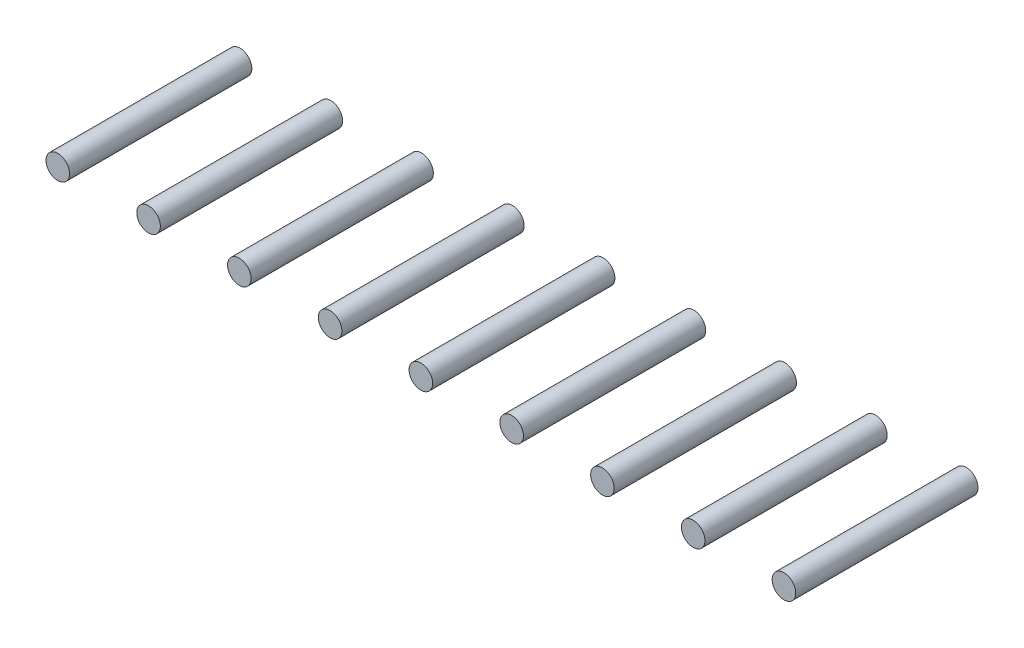
ISO-10303-21;
HEADER;
FILE_DESCRIPTION(('STEP AP214'),'2;1');
FILE_NAME('part.step','',(''),(''),'','','');
FILE_SCHEMA(('AUTOMOTIVE_DESIGN { 1 0 10303 214 1 1 1 1 }'));
ENDSEC;
DATA;
#1=APPLICATION_CONTEXT('core data for automotive mechanical design processes');
#2=APPLICATION_PROTOCOL_DEFINITION('international standard','automotive_design',2000,#1);
#3=PRODUCT_CONTEXT('',#1,'mechanical');
#4=PRODUCT('Part','Part','',(#3));
#5=PRODUCT_RELATED_PRODUCT_CATEGORY('part','',(#4));
#6=PRODUCT_DEFINITION_FORMATION('','',#4);
#7=PRODUCT_DEFINITION_CONTEXT('part definition',#1,'design');
#8=PRODUCT_DEFINITION('design','',#6,#7);
#9=PRODUCT_DEFINITION_SHAPE('','',#8);
#10=(LENGTH_UNIT() NAMED_UNIT(*) SI_UNIT(.MILLI.,.METRE.));
#11=(NAMED_UNIT(*) PLANE_ANGLE_UNIT() SI_UNIT($,.RADIAN.));
#12=(NAMED_UNIT(*) SI_UNIT($,.STERADIAN.) SOLID_ANGLE_UNIT());
#13=UNCERTAINTY_MEASURE_WITH_UNIT(LENGTH_MEASURE(1.E-05),#10,'distance_accuracy_value','');
#14=(GEOMETRIC_REPRESENTATION_CONTEXT(3) GLOBAL_UNCERTAINTY_ASSIGNED_CONTEXT((#13)) GLOBAL_UNIT_ASSIGNED_CONTEXT((#10,
#11,#12)) REPRESENTATION_CONTEXT('',''));
#15=CARTESIAN_POINT('',(0.,0.,0.));
#16=DIRECTION('',(0.,0.,1.));
#17=DIRECTION('',(1.,0.,0.));
#18=AXIS2_PLACEMENT_3D('',#15,#16,#17);
#19=CARTESIAN_POINT('',(0.,0.,-5.));
#20=DIRECTION('',(0.,0.,1.));
#21=DIRECTION('',(1.,0.,0.));
#22=AXIS2_PLACEMENT_3D('',#19,#20,#21);
#23=PLANE('',#22);
#24=CARTESIAN_POINT('',(0.,0.,-5.));
#25=DIRECTION('',(0.,0.,1.));
#26=DIRECTION('',(1.,0.,0.));
#27=AXIS2_PLACEMENT_3D('',#24,#25,#26);
#28=CIRCLE('',#27,0.33);
#29=CARTESIAN_POINT('',(0.33,0.,-5.));
#30=VERTEX_POINT('',#29);
#31=EDGE_CURVE('P0_E11',#30,#30,#28,.T.);
#32=ORIENTED_EDGE('',*,*,#31,.F.);
#33=EDGE_LOOP('',(#32));
#34=FACE_BOUND('',#33,.T.);
#35=ADVANCED_FACE('P0_F16',(#34),#23,.F.);
#36=CARTESIAN_POINT('',(0.,0.,0.1));
#37=DIRECTION('',(0.,0.,1.));
#38=DIRECTION('',(1.,0.,0.));
#39=AXIS2_PLACEMENT_3D('',#36,#37,#38);
#40=PLANE('',#39);
#41=CARTESIAN_POINT('',(0.,0.,0.1));
#42=DIRECTION('',(0.,0.,1.));
#43=DIRECTION('',(1.,0.,0.));
#44=AXIS2_PLACEMENT_3D('',#41,#42,#43);
#45=CIRCLE('',#44,0.33);
#46=CARTESIAN_POINT('',(0.33,0.,0.1));
#47=VERTEX_POINT('',#46);
#48=EDGE_CURVE('P0_E41',#47,#47,#45,.T.);
#49=ORIENTED_EDGE('',*,*,#48,.T.);
#50=EDGE_LOOP('',(#49));
#51=FACE_BOUND('',#50,.T.);
#52=ADVANCED_FACE('P0_F44',(#51),#40,.T.);
#53=CARTESIAN_POINT('',(0.,0.,-5.));
#54=DIRECTION('',(0.,0.,1.));
#55=DIRECTION('',(1.,0.,0.));
#56=AXIS2_PLACEMENT_3D('',#53,#54,#55);
#57=CYLINDRICAL_SURFACE('',#56,0.33);
#58=ORIENTED_EDGE('',*,*,#48,.F.);
#59=DIRECTION('',(0.,0.,1.));
#60=VECTOR('',#59,1.);
#61=CARTESIAN_POINT('',(0.33,0.,-5.));
#62=LINE('',#61,#60);
#63=EDGE_CURVE('P0_E20',#30,#47,#62,.T.);
#64=ORIENTED_EDGE('',*,*,#63,.F.);
#65=ORIENTED_EDGE('',*,*,#31,.T.);
#66=ORIENTED_EDGE('',*,*,#63,.T.);
#67=EDGE_LOOP('',(#58,#64,#65,#66));
#68=FACE_BOUND('',#67,.T.);
#69=ADVANCED_FACE('P0_F18',(#68),#57,.T.);
#70=CLOSED_SHELL('',(#35,#52,#69));
#71=MANIFOLD_SOLID_BREP('P0_B1',#70);
#72=CARTESIAN_POINT('',(2.54,0.,-5.));
#73=DIRECTION('',(0.,0.,1.));
#74=DIRECTION('',(1.,0.,0.));
#75=AXIS2_PLACEMENT_3D('',#72,#73,#74);
#76=PLANE('',#75);
#77=CARTESIAN_POINT('',(2.54,0.,-5.));
#78=DIRECTION('',(0.,0.,1.));
#79=DIRECTION('',(1.,0.,0.));
#80=AXIS2_PLACEMENT_3D('',#77,#78,#79);
#81=CIRCLE('',#80,0.33);
#82=CARTESIAN_POINT('',(2.87,0.,-5.));
#83=VERTEX_POINT('',#82);
#84=EDGE_CURVE('P1_E11',#83,#83,#81,.T.);
#85=ORIENTED_EDGE('',*,*,#84,.F.);
#86=EDGE_LOOP('',(#85));
#87=FACE_BOUND('',#86,.T.);
#88=ADVANCED_FACE('P1_F16',(#87),#76,.F.);
#89=CARTESIAN_POINT('',(2.54,0.,0.1));
#90=DIRECTION('',(0.,0.,1.));
#91=DIRECTION('',(1.,0.,0.));
#92=AXIS2_PLACEMENT_3D('',#89,#90,#91);
#93=PLANE('',#92);
#94=CARTESIAN_POINT('',(2.54,0.,0.1));
#95=DIRECTION('',(0.,0.,1.));
#96=DIRECTION('',(1.,0.,0.));
#97=AXIS2_PLACEMENT_3D('',#94,#95,#96);
#98=CIRCLE('',#97,0.33);
#99=CARTESIAN_POINT('',(2.87,0.,0.1));
#100=VERTEX_POINT('',#99);
#101=EDGE_CURVE('P1_E40',#100,#100,#98,.T.);
#102=ORIENTED_EDGE('',*,*,#101,.T.);
#103=EDGE_LOOP('',(#102));
#104=FACE_BOUND('',#103,.T.);
#105=ADVANCED_FACE('P1_F43',(#104),#93,.T.);
#106=CARTESIAN_POINT('',(2.54,0.,-5.));
#107=DIRECTION('',(0.,0.,1.));
#108=DIRECTION('',(1.,0.,0.));
#109=AXIS2_PLACEMENT_3D('',#106,#107,#108);
#110=CYLINDRICAL_SURFACE('',#109,0.33);
#111=ORIENTED_EDGE('',*,*,#101,.F.);
#112=DIRECTION('',(0.,0.,1.));
#113=VECTOR('',#112,1.);
#114=CARTESIAN_POINT('',(2.87,0.,-5.));
#115=LINE('',#114,#113);
#116=EDGE_CURVE('P1_E24',#83,#100,#115,.T.);
#117=ORIENTED_EDGE('',*,*,#116,.F.);
#118=ORIENTED_EDGE('',*,*,#84,.T.);
#119=ORIENTED_EDGE('',*,*,#116,.T.);
#120=EDGE_LOOP('',(#111,#117,#118,#119));
#121=FACE_BOUND('',#120,.T.);
#122=ADVANCED_FACE('P1_F39',(#121),#110,.T.);
#123=CLOSED_SHELL('',(#88,#105,#122));
#124=MANIFOLD_SOLID_BREP('P1_B1',#123);
#125=CARTESIAN_POINT('',(5.08,0.,-5.));
#126=DIRECTION('',(0.,0.,1.));
#127=DIRECTION('',(1.,0.,0.));
#128=AXIS2_PLACEMENT_3D('',#125,#126,#127);
#129=PLANE('',#128);
#130=CARTESIAN_POINT('',(5.08,0.,-5.));
#131=DIRECTION('',(0.,0.,1.));
#132=DIRECTION('',(1.,0.,0.));
#133=AXIS2_PLACEMENT_3D('',#130,#131,#132);
#134=CIRCLE('',#133,0.33);
#135=CARTESIAN_POINT('',(5.41,0.,-5.));
#136=VERTEX_POINT('',#135);
#137=EDGE_CURVE('P2_E11',#136,#136,#134,.T.);
#138=ORIENTED_EDGE('',*,*,#137,.F.);
#139=EDGE_LOOP('',(#138));
#140=FACE_BOUND('',#139,.T.);
#141=ADVANCED_FACE('P2_F16',(#140),#129,.F.);
#142=CARTESIAN_POINT('',(5.08,0.,0.1));
#143=DIRECTION('',(0.,0.,1.));
#144=DIRECTION('',(1.,0.,0.));
#145=AXIS2_PLACEMENT_3D('',#142,#143,#144);
#146=PLANE('',#145);
#147=CARTESIAN_POINT('',(5.08,0.,0.1));
#148=DIRECTION('',(0.,0.,1.));
#149=DIRECTION('',(1.,0.,0.));
#150=AXIS2_PLACEMENT_3D('',#147,#148,#149);
#151=CIRCLE('',#150,0.33);
#152=CARTESIAN_POINT('',(5.41,0.,0.1));
#153=VERTEX_POINT('',#152);
#154=EDGE_CURVE('P2_E41',#153,#153,#151,.T.);
#155=ORIENTED_EDGE('',*,*,#154,.T.);
#156=EDGE_LOOP('',(#155));
#157=FACE_BOUND('',#156,.T.);
#158=ADVANCED_FACE('P2_F44',(#157),#146,.T.);
#159=CARTESIAN_POINT('',(5.08,0.,-5.));
#160=DIRECTION('',(0.,0.,1.));
#161=DIRECTION('',(1.,0.,0.));
#162=AXIS2_PLACEMENT_3D('',#159,#160,#161);
#163=CYLINDRICAL_SURFACE('',#162,0.33);
#164=ORIENTED_EDGE('',*,*,#154,.F.);
#165=DIRECTION('',(0.,0.,1.));
#166=VECTOR('',#165,1.);
#167=CARTESIAN_POINT('',(5.41,0.,-5.));
#168=LINE('',#167,#166);
#169=EDGE_CURVE('P2_E20',#136,#153,#168,.T.);
#170=ORIENTED_EDGE('',*,*,#169,.F.);
#171=ORIENTED_EDGE('',*,*,#137,.T.);
#172=ORIENTED_EDGE('',*,*,#169,.T.);
#173=EDGE_LOOP('',(#164,#170,#171,#172));
#174=FACE_BOUND('',#173,.T.);
#175=ADVANCED_FACE('P2_F18',(#174),#163,.T.);
#176=CLOSED_SHELL('',(#141,#158,#175));
#177=MANIFOLD_SOLID_BREP('P2_B1',#176);
#178=CARTESIAN_POINT('',(7.62,0.,-5.));
#179=DIRECTION('',(0.,0.,1.));
#180=DIRECTION('',(1.,0.,0.));
#181=AXIS2_PLACEMENT_3D('',#178,#179,#180);
#182=PLANE('',#181);
#183=CARTESIAN_POINT('',(7.62,0.,-5.));
#184=DIRECTION('',(0.,0.,1.));
#185=DIRECTION('',(1.,0.,0.));
#186=AXIS2_PLACEMENT_3D('',#183,#184,#185);
#187=CIRCLE('',#186,0.33);
#188=CARTESIAN_POINT('',(7.95,0.,-5.));
#189=VERTEX_POINT('',#188);
#190=EDGE_CURVE('P3_E11',#189,#189,#187,.T.);
#191=ORIENTED_EDGE('',*,*,#190,.F.);
#192=EDGE_LOOP('',(#191));
#193=FACE_BOUND('',#192,.T.);
#194=ADVANCED_FACE('P3_F16',(#193),#182,.F.);
#195=CARTESIAN_POINT('',(7.62,0.,0.1));
#196=DIRECTION('',(0.,0.,1.));
#197=DIRECTION('',(1.,0.,0.));
#198=AXIS2_PLACEMENT_3D('',#195,#196,#197);
#199=PLANE('',#198);
#200=CARTESIAN_POINT('',(7.62,0.,0.1));
#201=DIRECTION('',(0.,0.,1.));
#202=DIRECTION('',(1.,0.,0.));
#203=AXIS2_PLACEMENT_3D('',#200,#201,#202);
#204=CIRCLE('',#203,0.33);
#205=CARTESIAN_POINT('',(7.95,0.,0.1));
#206=VERTEX_POINT('',#205);
#207=EDGE_CURVE('P3_E42',#206,#206,#204,.T.);
#208=ORIENTED_EDGE('',*,*,#207,.T.);
#209=EDGE_LOOP('',(#208));
#210=FACE_BOUND('',#209,.T.);
#211=ADVANCED_FACE('P3_F18',(#210),#199,.T.);
#212=CARTESIAN_POINT('',(7.62,0.,-5.));
#213=DIRECTION('',(0.,0.,1.));
#214=DIRECTION('',(1.,0.,0.));
#215=AXIS2_PLACEMENT_3D('',#212,#213,#214);
#216=CYLINDRICAL_SURFACE('',#215,0.33);
#217=ORIENTED_EDGE('',*,*,#207,.F.);
#218=DIRECTION('',(0.,0.,1.));
#219=VECTOR('',#218,1.);
#220=CARTESIAN_POINT('',(7.95,0.,-5.));
#221=LINE('',#220,#219);
#222=EDGE_CURVE('P3_E20',#189,#206,#221,.T.);
#223=ORIENTED_EDGE('',*,*,#222,.F.);
#224=ORIENTED_EDGE('',*,*,#190,.T.);
#225=ORIENTED_EDGE('',*,*,#222,.T.);
#226=EDGE_LOOP('',(#217,#223,#224,#225));
#227=FACE_BOUND('',#226,.T.);
#228=ADVANCED_FACE('P3_F41',(#227),#216,.T.);
#229=CLOSED_SHELL('',(#194,#211,#228));
#230=MANIFOLD_SOLID_BREP('P3_B1',#229);
#231=CARTESIAN_POINT('',(10.16,0.,-5.));
#232=DIRECTION('',(0.,0.,1.));
#233=DIRECTION('',(1.,0.,0.));
#234=AXIS2_PLACEMENT_3D('',#231,#232,#233);
#235=PLANE('',#234);
#236=CARTESIAN_POINT('',(10.16,0.,-5.));
#237=DIRECTION('',(0.,0.,1.));
#238=DIRECTION('',(1.,0.,0.));
#239=AXIS2_PLACEMENT_3D('',#236,#237,#238);
#240=CIRCLE('',#239,0.33);
#241=CARTESIAN_POINT('',(10.49,0.,-5.));
#242=VERTEX_POINT('',#241);
#243=EDGE_CURVE('P4_E11',#242,#242,#240,.T.);
#244=ORIENTED_EDGE('',*,*,#243,.F.);
#245=EDGE_LOOP('',(#244));
#246=FACE_BOUND('',#245,.T.);
#247=ADVANCED_FACE('P4_F16',(#246),#235,.F.);
#248=CARTESIAN_POINT('',(10.16,0.,0.1));
#249=DIRECTION('',(0.,0.,1.));
#250=DIRECTION('',(1.,0.,0.));
#251=AXIS2_PLACEMENT_3D('',#248,#249,#250);
#252=PLANE('',#251);
#253=CARTESIAN_POINT('',(10.16,0.,0.1));
#254=DIRECTION('',(0.,0.,1.));
#255=DIRECTION('',(1.,0.,0.));
#256=AXIS2_PLACEMENT_3D('',#253,#254,#255);
#257=CIRCLE('',#256,0.33);
#258=CARTESIAN_POINT('',(10.49,0.,0.1));
#259=VERTEX_POINT('',#258);
#260=EDGE_CURVE('P4_E41',#259,#259,#257,.T.);
#261=ORIENTED_EDGE('',*,*,#260,.T.);
#262=EDGE_LOOP('',(#261));
#263=FACE_BOUND('',#262,.T.);
#264=ADVANCED_FACE('P4_F44',(#263),#252,.T.);
#265=CARTESIAN_POINT('',(10.16,0.,-5.));
#266=DIRECTION('',(0.,0.,1.));
#267=DIRECTION('',(1.,0.,0.));
#268=AXIS2_PLACEMENT_3D('',#265,#266,#267);
#269=CYLINDRICAL_SURFACE('',#268,0.33);
#270=ORIENTED_EDGE('',*,*,#260,.F.);
#271=DIRECTION('',(0.,0.,1.));
#272=VECTOR('',#271,1.);
#273=CARTESIAN_POINT('',(10.49,0.,-5.));
#274=LINE('',#273,#272);
#275=EDGE_CURVE('P4_E19',#242,#259,#274,.T.);
#276=ORIENTED_EDGE('',*,*,#275,.F.);
#277=ORIENTED_EDGE('',*,*,#243,.T.);
#278=ORIENTED_EDGE('',*,*,#275,.T.);
#279=EDGE_LOOP('',(#270,#276,#277,#278));
#280=FACE_BOUND('',#279,.T.);
#281=ADVANCED_FACE('P4_F40',(#280),#269,.T.);
#282=CLOSED_SHELL('',(#247,#264,#281));
#283=MANIFOLD_SOLID_BREP('P4_B1',#282);
#284=CARTESIAN_POINT('',(12.7,0.,-5.));
#285=DIRECTION('',(0.,0.,1.));
#286=DIRECTION('',(1.,0.,0.));
#287=AXIS2_PLACEMENT_3D('',#284,#285,#286);
#288=PLANE('',#287);
#289=CARTESIAN_POINT('',(12.7,0.,-5.));
#290=DIRECTION('',(0.,0.,1.));
#291=DIRECTION('',(1.,0.,0.));
#292=AXIS2_PLACEMENT_3D('',#289,#290,#291);
#293=CIRCLE('',#292,0.33);
#294=CARTESIAN_POINT('',(13.03,0.,-5.));
#295=VERTEX_POINT('',#294);
#296=EDGE_CURVE('P5_E11',#295,#295,#293,.T.);
#297=ORIENTED_EDGE('',*,*,#296,.F.);
#298=EDGE_LOOP('',(#297));
#299=FACE_BOUND('',#298,.T.);
#300=ADVANCED_FACE('P5_F16',(#299),#288,.F.);
#301=CARTESIAN_POINT('',(12.7,0.,0.1));
#302=DIRECTION('',(0.,0.,1.));
#303=DIRECTION('',(1.,0.,0.));
#304=AXIS2_PLACEMENT_3D('',#301,#302,#303);
#305=PLANE('',#304);
#306=CARTESIAN_POINT('',(12.7,0.,0.1));
#307=DIRECTION('',(0.,0.,1.));
#308=DIRECTION('',(1.,0.,0.));
#309=AXIS2_PLACEMENT_3D('',#306,#307,#308);
#310=CIRCLE('',#309,0.33);
#311=CARTESIAN_POINT('',(13.03,0.,0.1));
#312=VERTEX_POINT('',#311);
#313=EDGE_CURVE('P5_E20',#312,#312,#310,.T.);
#314=ORIENTED_EDGE('',*,*,#313,.T.);
#315=EDGE_LOOP('',(#314));
#316=FACE_BOUND('',#315,.T.);
#317=ADVANCED_FACE('P5_F44',(#316),#305,.T.);
#318=CARTESIAN_POINT('',(12.7,0.,-5.));
#319=DIRECTION('',(0.,0.,1.));
#320=DIRECTION('',(1.,0.,0.));
#321=AXIS2_PLACEMENT_3D('',#318,#319,#320);
#322=CYLINDRICAL_SURFACE('',#321,0.33);
#323=ORIENTED_EDGE('',*,*,#313,.F.);
#324=DIRECTION('',(0.,0.,1.));
#325=VECTOR('',#324,1.);
#326=CARTESIAN_POINT('',(13.03,0.,-5.));
#327=LINE('',#326,#325);
#328=EDGE_CURVE('P5_E27',#295,#312,#327,.T.);
#329=ORIENTED_EDGE('',*,*,#328,.F.);
#330=ORIENTED_EDGE('',*,*,#296,.T.);
#331=ORIENTED_EDGE('',*,*,#328,.T.);
#332=EDGE_LOOP('',(#323,#329,#330,#331));
#333=FACE_BOUND('',#332,.T.);
#334=ADVANCED_FACE('P5_F18',(#333),#322,.T.);
#335=CLOSED_SHELL('',(#300,#317,#334));
#336=MANIFOLD_SOLID_BREP('P5_B1',#335);
#337=CARTESIAN_POINT('',(15.24,0.,-5.));
#338=DIRECTION('',(0.,0.,1.));
#339=DIRECTION('',(1.,0.,0.));
#340=AXIS2_PLACEMENT_3D('',#337,#338,#339);
#341=PLANE('',#340);
#342=CARTESIAN_POINT('',(15.24,0.,-5.));
#343=DIRECTION('',(0.,0.,1.));
#344=DIRECTION('',(1.,0.,0.));
#345=AXIS2_PLACEMENT_3D('',#342,#343,#344);
#346=CIRCLE('',#345,0.33);
#347=CARTESIAN_POINT('',(15.57,0.,-5.));
#348=VERTEX_POINT('',#347);
#349=EDGE_CURVE('P6_E11',#348,#348,#346,.T.);
#350=ORIENTED_EDGE('',*,*,#349,.F.);
#351=EDGE_LOOP('',(#350));
#352=FACE_BOUND('',#351,.T.);
#353=ADVANCED_FACE('P6_F16',(#352),#341,.F.);
#354=CARTESIAN_POINT('',(15.24,0.,0.1));
#355=DIRECTION('',(0.,0.,1.));
#356=DIRECTION('',(1.,0.,0.));
#357=AXIS2_PLACEMENT_3D('',#354,#355,#356);
#358=PLANE('',#357);
#359=CARTESIAN_POINT('',(15.24,0.,0.1));
#360=DIRECTION('',(0.,0.,1.));
#361=DIRECTION('',(1.,0.,0.));
#362=AXIS2_PLACEMENT_3D('',#359,#360,#361);
#363=CIRCLE('',#362,0.33);
#364=CARTESIAN_POINT('',(15.57,0.,0.1));
#365=VERTEX_POINT('',#364);
#366=EDGE_CURVE('P6_E41',#365,#365,#363,.T.);
#367=ORIENTED_EDGE('',*,*,#366,.T.);
#368=EDGE_LOOP('',(#367));
#369=FACE_BOUND('',#368,.T.);
#370=ADVANCED_FACE('P6_F18',(#369),#358,.T.);
#371=CARTESIAN_POINT('',(15.24,0.,-5.));
#372=DIRECTION('',(0.,0.,1.));
#373=DIRECTION('',(1.,0.,0.));
#374=AXIS2_PLACEMENT_3D('',#371,#372,#373);
#375=CYLINDRICAL_SURFACE('',#374,0.33);
#376=ORIENTED_EDGE('',*,*,#366,.F.);
#377=DIRECTION('',(0.,0.,1.));
#378=VECTOR('',#377,1.);
#379=CARTESIAN_POINT('',(15.57,0.,-5.));
#380=LINE('',#379,#378);
#381=EDGE_CURVE('P6_E25',#348,#365,#380,.T.);
#382=ORIENTED_EDGE('',*,*,#381,.F.);
#383=ORIENTED_EDGE('',*,*,#349,.T.);
#384=ORIENTED_EDGE('',*,*,#381,.T.);
#385=EDGE_LOOP('',(#376,#382,#383,#384));
#386=FACE_BOUND('',#385,.T.);
#387=ADVANCED_FACE('P6_F40',(#386),#375,.T.);
#388=CLOSED_SHELL('',(#353,#370,#387));
#389=MANIFOLD_SOLID_BREP('P6_B1',#388);
#390=CARTESIAN_POINT('',(17.78,0.,-5.));
#391=DIRECTION('',(0.,0.,1.));
#392=DIRECTION('',(1.,0.,0.));
#393=AXIS2_PLACEMENT_3D('',#390,#391,#392);
#394=PLANE('',#393);
#395=CARTESIAN_POINT('',(17.78,0.,-5.));
#396=DIRECTION('',(0.,0.,1.));
#397=DIRECTION('',(1.,0.,0.));
#398=AXIS2_PLACEMENT_3D('',#395,#396,#397);
#399=CIRCLE('',#398,0.33);
#400=CARTESIAN_POINT('',(18.11,0.,-5.));
#401=VERTEX_POINT('',#400);
#402=EDGE_CURVE('P7_E11',#401,#401,#399,.T.);
#403=ORIENTED_EDGE('',*,*,#402,.F.);
#404=EDGE_LOOP('',(#403));
#405=FACE_BOUND('',#404,.T.);
#406=ADVANCED_FACE('P7_F16',(#405),#394,.F.);
#407=CARTESIAN_POINT('',(17.78,0.,0.1));
#408=DIRECTION('',(0.,0.,1.));
#409=DIRECTION('',(1.,0.,0.));
#410=AXIS2_PLACEMENT_3D('',#407,#408,#409);
#411=PLANE('',#410);
#412=CARTESIAN_POINT('',(17.78,0.,0.1));
#413=DIRECTION('',(0.,0.,1.));
#414=DIRECTION('',(1.,0.,0.));
#415=AXIS2_PLACEMENT_3D('',#412,#413,#414);
#416=CIRCLE('',#415,0.33);
#417=CARTESIAN_POINT('',(18.11,0.,0.1));
#418=VERTEX_POINT('',#417);
#419=EDGE_CURVE('P7_E41',#418,#418,#416,.T.);
#420=ORIENTED_EDGE('',*,*,#419,.T.);
#421=EDGE_LOOP('',(#420));
#422=FACE_BOUND('',#421,.T.);
#423=ADVANCED_FACE('P7_F18',(#422),#411,.T.);
#424=CARTESIAN_POINT('',(17.78,0.,-5.));
#425=DIRECTION('',(0.,0.,1.));
#426=DIRECTION('',(1.,0.,0.));
#427=AXIS2_PLACEMENT_3D('',#424,#425,#426);
#428=CYLINDRICAL_SURFACE('',#427,0.33);
#429=ORIENTED_EDGE('',*,*,#419,.F.);
#430=DIRECTION('',(0.,0.,1.));
#431=VECTOR('',#430,1.);
#432=CARTESIAN_POINT('',(18.11,0.,-5.));
#433=LINE('',#432,#431);
#434=EDGE_CURVE('P7_E20',#401,#418,#433,.T.);
#435=ORIENTED_EDGE('',*,*,#434,.F.);
#436=ORIENTED_EDGE('',*,*,#402,.T.);
#437=ORIENTED_EDGE('',*,*,#434,.T.);
#438=EDGE_LOOP('',(#429,#435,#436,#437));
#439=FACE_BOUND('',#438,.T.);
#440=ADVANCED_FACE('P7_F40',(#439),#428,.T.);
#441=CLOSED_SHELL('',(#406,#423,#440));
#442=MANIFOLD_SOLID_BREP('P7_B1',#441);
#443=CARTESIAN_POINT('',(20.32,0.,-5.));
#444=DIRECTION('',(0.,0.,1.));
#445=DIRECTION('',(1.,0.,0.));
#446=AXIS2_PLACEMENT_3D('',#443,#444,#445);
#447=PLANE('',#446);
#448=CARTESIAN_POINT('',(20.32,0.,-5.));
#449=DIRECTION('',(0.,0.,1.));
#450=DIRECTION('',(1.,0.,0.));
#451=AXIS2_PLACEMENT_3D('',#448,#449,#450);
#452=CIRCLE('',#451,0.33);
#453=CARTESIAN_POINT('',(20.65,0.,-5.));
#454=VERTEX_POINT('',#453);
#455=EDGE_CURVE('P8_E11',#454,#454,#452,.T.);
#456=ORIENTED_EDGE('',*,*,#455,.F.);
#457=EDGE_LOOP('',(#456));
#458=FACE_BOUND('',#457,.T.);
#459=ADVANCED_FACE('P8_F16',(#458),#447,.F.);
#460=CARTESIAN_POINT('',(20.32,0.,0.1));
#461=DIRECTION('',(0.,0.,1.));
#462=DIRECTION('',(1.,0.,0.));
#463=AXIS2_PLACEMENT_3D('',#460,#461,#462);
#464=PLANE('',#463);
#465=CARTESIAN_POINT('',(20.32,0.,0.1));
#466=DIRECTION('',(0.,0.,1.));
#467=DIRECTION('',(1.,0.,0.));
#468=AXIS2_PLACEMENT_3D('',#465,#466,#467);
#469=CIRCLE('',#468,0.33);
#470=CARTESIAN_POINT('',(20.65,0.,0.1));
#471=VERTEX_POINT('',#470);
#472=EDGE_CURVE('P8_E19',#471,#471,#469,.T.);
#473=ORIENTED_EDGE('',*,*,#472,.T.);
#474=EDGE_LOOP('',(#473));
#475=FACE_BOUND('',#474,.T.);
#476=ADVANCED_FACE('P8_F44',(#475),#464,.T.);
#477=CARTESIAN_POINT('',(20.32,0.,-5.));
#478=DIRECTION('',(0.,0.,1.));
#479=DIRECTION('',(1.,0.,0.));
#480=AXIS2_PLACEMENT_3D('',#477,#478,#479);
#481=CYLINDRICAL_SURFACE('',#480,0.33);
#482=ORIENTED_EDGE('',*,*,#472,.F.);
#483=DIRECTION('',(0.,0.,1.));
#484=VECTOR('',#483,1.);
#485=CARTESIAN_POINT('',(20.65,0.,-5.));
#486=LINE('',#485,#484);
#487=EDGE_CURVE('P8_E25',#454,#471,#486,.T.);
#488=ORIENTED_EDGE('',*,*,#487,.F.);
#489=ORIENTED_EDGE('',*,*,#455,.T.);
#490=ORIENTED_EDGE('',*,*,#487,.T.);
#491=EDGE_LOOP('',(#482,#488,#489,#490));
#492=FACE_BOUND('',#491,.T.);
#493=ADVANCED_FACE('P8_F41',(#492),#481,.T.);
#494=CLOSED_SHELL('',(#459,#476,#493));
#495=MANIFOLD_SOLID_BREP('P8_B1',#494);
#496=ADVANCED_BREP_SHAPE_REPRESENTATION('',(#18,#71,#124,#177,#230,#283,#336,#389,#442,#495),#14);
#497=SHAPE_DEFINITION_REPRESENTATION(#9,#496);
ENDSEC;
END-ISO-10303-21;
